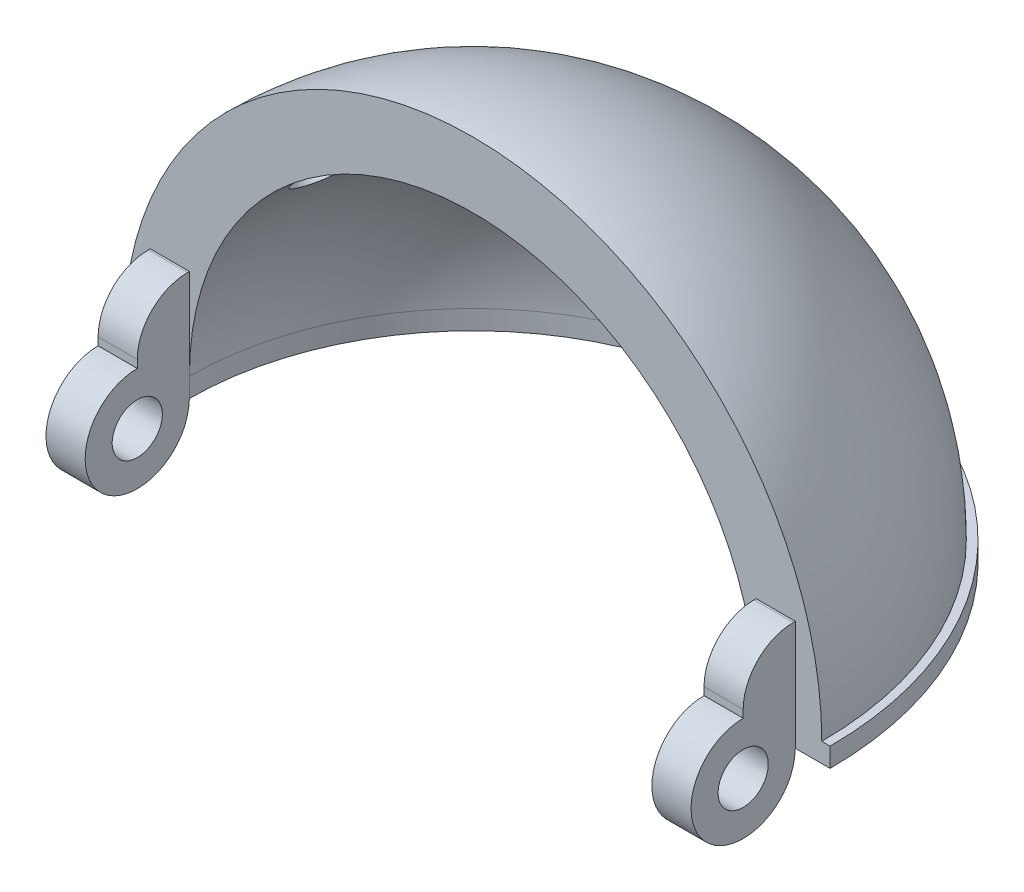
ISO-10303-21;
HEADER;
FILE_DESCRIPTION(('STEP AP214'),'2;1');
FILE_NAME('part.step','',(''),(''),'','','');
FILE_SCHEMA(('AUTOMOTIVE_DESIGN { 1 0 10303 214 1 1 1 1 }'));
ENDSEC;
DATA;
#1=APPLICATION_CONTEXT('core data for automotive mechanical design processes');
#2=APPLICATION_PROTOCOL_DEFINITION('international standard','automotive_design',2000,#1);
#3=PRODUCT_CONTEXT('',#1,'mechanical');
#4=PRODUCT('Part','Part','',(#3));
#5=PRODUCT_RELATED_PRODUCT_CATEGORY('part','',(#4));
#6=PRODUCT_DEFINITION_FORMATION('','',#4);
#7=PRODUCT_DEFINITION_CONTEXT('part definition',#1,'design');
#8=PRODUCT_DEFINITION('design','',#6,#7);
#9=PRODUCT_DEFINITION_SHAPE('','',#8);
#10=(LENGTH_UNIT() NAMED_UNIT(*) SI_UNIT(.MILLI.,.METRE.));
#11=(NAMED_UNIT(*) PLANE_ANGLE_UNIT() SI_UNIT($,.RADIAN.));
#12=(NAMED_UNIT(*) SI_UNIT($,.STERADIAN.) SOLID_ANGLE_UNIT());
#13=UNCERTAINTY_MEASURE_WITH_UNIT(LENGTH_MEASURE(1.E-05),#10,'distance_accuracy_value','');
#14=(GEOMETRIC_REPRESENTATION_CONTEXT(3) GLOBAL_UNCERTAINTY_ASSIGNED_CONTEXT((#13)) GLOBAL_UNIT_ASSIGNED_CONTEXT((#10,
#11,#12)) REPRESENTATION_CONTEXT('',''));
#15=CARTESIAN_POINT('',(0.,0.,0.));
#16=DIRECTION('',(0.,0.,1.));
#17=DIRECTION('',(1.,0.,0.));
#18=AXIS2_PLACEMENT_3D('',#15,#16,#17);
#19=CARTESIAN_POINT('',(-16.1602681796989,3.93657637130622,0.126576371306225));
#20=DIRECTION('',(1.,0.,0.));
#21=DIRECTION('',(0.,0.,-1.));
#22=AXIS2_PLACEMENT_3D('',#19,#20,#21);
#23=CYLINDRICAL_SURFACE('',#22,3.302);
#24=DIRECTION('',(-1.,0.,0.));
#25=VECTOR('',#24,1.);
#26=CARTESIAN_POINT('',(-16.1602681796989,3.93657637130622,3.42857637130622));
#27=LINE('',#26,#25);
#28=CARTESIAN_POINT('',(-13.5836555670863,3.93657637130622,3.42857637130622));
#29=VERTEX_POINT('',#28);
#30=CARTESIAN_POINT('',(-16.1602681796989,3.93657637130622,3.42857637130622));
#31=VERTEX_POINT('',#30);
#32=EDGE_CURVE('E259',#29,#31,#27,.T.);
#33=ORIENTED_EDGE('',*,*,#32,.F.);
#34=CARTESIAN_POINT('',(-13.5836555670863,3.93657637130622,0.126576371306225));
#35=DIRECTION('',(1.,0.,0.));
#36=DIRECTION('',(0.,0.,-1.));
#37=AXIS2_PLACEMENT_3D('',#34,#35,#36);
#38=CIRCLE('',#37,3.302);
#39=CARTESIAN_POINT('',(-13.5836555670863,7.23857637130622,0.126576371306224));
#40=VERTEX_POINT('',#39);
#41=EDGE_CURVE('E43',#40,#29,#38,.T.);
#42=ORIENTED_EDGE('',*,*,#41,.F.);
#43=DIRECTION('',(-1.,0.,0.));
#44=VECTOR('',#43,1.);
#45=CARTESIAN_POINT('',(-16.1602681796989,7.23857637130622,0.126576371306225));
#46=LINE('',#45,#44);
#47=CARTESIAN_POINT('',(-16.1602681796989,7.23857637130622,0.126576371306224));
#48=VERTEX_POINT('',#47);
#49=EDGE_CURVE('E261',#48,#40,#46,.F.);
#50=ORIENTED_EDGE('',*,*,#49,.F.);
#51=CARTESIAN_POINT('',(-16.1602681796989,3.93657637130622,0.126576371306225));
#52=DIRECTION('',(1.,0.,0.));
#53=DIRECTION('',(0.,0.,-1.));
#54=AXIS2_PLACEMENT_3D('',#51,#52,#53);
#55=CIRCLE('',#54,3.302);
#56=EDGE_CURVE('E11',#31,#48,#55,.F.);
#57=ORIENTED_EDGE('',*,*,#56,.F.);
#58=EDGE_LOOP('',(#33,#42,#50,#57));
#59=FACE_BOUND('',#58,.T.);
#60=ADVANCED_FACE('F35',(#59),#23,.T.);
#61=CARTESIAN_POINT('',(0.,3.93657637130622,0.126576371306225));
#62=DIRECTION('',(-1.,0.,0.));
#63=DIRECTION('',(0.,0.,1.));
#64=AXIS2_PLACEMENT_3D('',#61,#62,#63);
#65=CYLINDRICAL_SURFACE('',#64,3.302);
#66=DIRECTION('',(1.,0.,0.));
#67=VECTOR('',#66,1.);
#68=CARTESIAN_POINT('',(0.,7.23857637130622,0.126576371306225));
#69=LINE('',#68,#67);
#70=CARTESIAN_POINT('',(23.6963744629437,7.23857637130622,0.126576371306224));
#71=VERTEX_POINT('',#70);
#72=CARTESIAN_POINT('',(26.2729870755564,7.23857637130622,0.126576371306224));
#73=VERTEX_POINT('',#72);
#74=EDGE_CURVE('E249',#71,#73,#69,.T.);
#75=ORIENTED_EDGE('',*,*,#74,.F.);
#76=CARTESIAN_POINT('',(23.6963744629438,3.93657637130622,0.126576371306225));
#77=DIRECTION('',(-1.,0.,0.));
#78=DIRECTION('',(0.,0.,1.));
#79=AXIS2_PLACEMENT_3D('',#76,#77,#78);
#80=CIRCLE('',#79,3.302);
#81=CARTESIAN_POINT('',(23.6963744629437,3.93657637130622,3.42857637130622));
#82=VERTEX_POINT('',#81);
#83=EDGE_CURVE('E255',#82,#71,#80,.T.);
#84=ORIENTED_EDGE('',*,*,#83,.F.);
#85=DIRECTION('',(1.,0.,0.));
#86=VECTOR('',#85,1.);
#87=CARTESIAN_POINT('',(0.,3.93657637130622,3.42857637130622));
#88=LINE('',#87,#86);
#89=CARTESIAN_POINT('',(26.2729870755564,3.93657637130622,3.42857637130622));
#90=VERTEX_POINT('',#89);
#91=EDGE_CURVE('E252',#90,#82,#88,.F.);
#92=ORIENTED_EDGE('',*,*,#91,.F.);
#93=CARTESIAN_POINT('',(26.2729870755564,3.93657637130622,0.126576371306225));
#94=DIRECTION('',(-1.,0.,0.));
#95=DIRECTION('',(0.,0.,1.));
#96=AXIS2_PLACEMENT_3D('',#93,#94,#95);
#97=CIRCLE('',#96,3.302);
#98=EDGE_CURVE('E257',#73,#90,#97,.F.);
#99=ORIENTED_EDGE('',*,*,#98,.F.);
#100=EDGE_LOOP('',(#75,#84,#92,#99));
#101=FACE_BOUND('',#100,.T.);
#102=ADVANCED_FACE('F305',(#101),#65,.T.);
#103=CARTESIAN_POINT('',(23.6963744629438,1.27,0.));
#104=DIRECTION('',(0.,0.,-1.));
#105=DIRECTION('',(-1.,0.,0.));
#106=AXIS2_PLACEMENT_3D('',#103,#104,#105);
#107=PLANE('',#106);
#108=DIRECTION('',(0.,1.,0.));
#109=VECTOR('',#108,1.);
#110=CARTESIAN_POINT('',(-16.1602681796989,-50.292,0.));
#111=LINE('',#110,#109);
#112=CARTESIAN_POINT('',(-16.1602681796989,0.,0.));
#113=VERTEX_POINT('',#112);
#114=CARTESIAN_POINT('',(-16.1602681796989,7.23857637130622,0.));
#115=VERTEX_POINT('',#114);
#116=EDGE_CURVE('E188',#113,#115,#111,.T.);
#117=ORIENTED_EDGE('',*,*,#116,.T.);
#118=DIRECTION('',(-1.,0.,0.));
#119=VECTOR('',#118,1.);
#120=CARTESIAN_POINT('',(-16.1602681796989,7.23857637130622,0.));
#121=LINE('',#120,#119);
#122=CARTESIAN_POINT('',(-13.5836555670863,7.23857637130622,0.));
#123=VERTEX_POINT('',#122);
#124=EDGE_CURVE('E158',#123,#115,#121,.T.);
#125=ORIENTED_EDGE('',*,*,#124,.F.);
#126=DIRECTION('',(0.,1.,0.));
#127=VECTOR('',#126,1.);
#128=CARTESIAN_POINT('',(-13.5836555670863,-5.08,1.29236898960272E-13));
#129=LINE('',#128,#127);
#130=CARTESIAN_POINT('',(-13.5836555670863,1.27,1.29236898960272E-13));
#131=VERTEX_POINT('',#130);
#132=EDGE_CURVE('E212',#131,#123,#129,.T.);
#133=ORIENTED_EDGE('',*,*,#132,.F.);
#134=CARTESIAN_POINT('',(5.05635944792873,1.26999999999994,0.));
#135=DIRECTION('',(0.,0.,-1.));
#136=DIRECTION('',(0.,1.,0.));
#137=AXIS2_PLACEMENT_3D('',#134,#135,#136);
#138=CIRCLE('',#137,18.640015015015);
#139=CARTESIAN_POINT('',(23.6963744629438,1.27,0.));
#140=VERTEX_POINT('',#139);
#141=EDGE_CURVE('E226',#131,#140,#138,.T.);
#142=ORIENTED_EDGE('',*,*,#141,.T.);
#143=DIRECTION('',(0.,1.,0.));
#144=VECTOR('',#143,1.);
#145=CARTESIAN_POINT('',(23.6963744629438,-5.08,0.));
#146=LINE('',#145,#144);
#147=CARTESIAN_POINT('',(23.6963744629437,7.23857637130622,0.));
#148=VERTEX_POINT('',#147);
#149=EDGE_CURVE('E203',#140,#148,#146,.T.);
#150=ORIENTED_EDGE('',*,*,#149,.T.);
#151=DIRECTION('',(-1.,0.,0.));
#152=VECTOR('',#151,1.);
#153=CARTESIAN_POINT('',(23.6963744629437,7.23857637130622,0.));
#154=LINE('',#153,#152);
#155=CARTESIAN_POINT('',(26.2729870755564,7.23857637130622,0.));
#156=VERTEX_POINT('',#155);
#157=EDGE_CURVE('E283',#156,#148,#154,.T.);
#158=ORIENTED_EDGE('',*,*,#157,.F.);
#159=DIRECTION('',(0.,1.,0.));
#160=VECTOR('',#159,1.);
#161=CARTESIAN_POINT('',(26.2729870755564,-50.292,0.));
#162=LINE('',#161,#160);
#163=CARTESIAN_POINT('',(26.2729870755564,0.,0.));
#164=VERTEX_POINT('',#163);
#165=EDGE_CURVE('E191',#164,#156,#162,.T.);
#166=ORIENTED_EDGE('',*,*,#165,.F.);
#167=DIRECTION('',(1.,0.,0.));
#168=VECTOR('',#167,1.);
#169=CARTESIAN_POINT('',(5.05635944792873,0.,0.));
#170=LINE('',#169,#168);
#171=CARTESIAN_POINT('',(28.5589870755564,0.,0.));
#172=VERTEX_POINT('',#171);
#173=EDGE_CURVE('E195',#164,#172,#170,.T.);
#174=ORIENTED_EDGE('',*,*,#173,.T.);
#175=DIRECTION('',(0.,-1.,0.));
#176=VECTOR('',#175,1.);
#177=CARTESIAN_POINT('',(28.5589870755564,1.27,0.));
#178=LINE('',#177,#176);
#179=CARTESIAN_POINT('',(28.5589870755564,1.27,0.));
#180=VERTEX_POINT('',#179);
#181=EDGE_CURVE('E336',#180,#172,#178,.T.);
#182=ORIENTED_EDGE('',*,*,#181,.F.);
#183=DIRECTION('',(1.,0.,0.));
#184=VECTOR('',#183,1.);
#185=CARTESIAN_POINT('',(5.05635944792873,1.27,0.));
#186=LINE('',#185,#184);
#187=CARTESIAN_POINT('',(28.0143744629438,1.27,0.));
#188=VERTEX_POINT('',#187);
#189=EDGE_CURVE('E205',#188,#180,#186,.T.);
#190=ORIENTED_EDGE('',*,*,#189,.F.);
#191=CARTESIAN_POINT('',(5.05635944792873,1.27,0.));
#192=DIRECTION('',(0.,0.,1.));
#193=DIRECTION('',(0.,1.,0.));
#194=AXIS2_PLACEMENT_3D('',#191,#192,#193);
#195=CIRCLE('',#194,22.958015015015);
#196=CARTESIAN_POINT('',(-17.9016555670863,1.27,0.));
#197=VERTEX_POINT('',#196);
#198=EDGE_CURVE('E234',#188,#197,#195,.T.);
#199=ORIENTED_EDGE('',*,*,#198,.T.);
#200=DIRECTION('',(1.,0.,0.));
#201=VECTOR('',#200,1.);
#202=CARTESIAN_POINT('',(5.05635944792873,1.27,1.29236898960272E-13));
#203=LINE('',#202,#201);
#204=CARTESIAN_POINT('',(-18.4462681796989,1.27,1.29236898960272E-13));
#205=VERTEX_POINT('',#204);
#206=EDGE_CURVE('E220',#205,#197,#203,.T.);
#207=ORIENTED_EDGE('',*,*,#206,.F.);
#208=DIRECTION('',(0.,-1.,0.));
#209=VECTOR('',#208,1.);
#210=CARTESIAN_POINT('',(-18.4462681796989,1.27,0.));
#211=LINE('',#210,#209);
#212=CARTESIAN_POINT('',(-18.4462681796989,0.,1.29236898960272E-13));
#213=VERTEX_POINT('',#212);
#214=EDGE_CURVE('E232',#205,#213,#211,.T.);
#215=ORIENTED_EDGE('',*,*,#214,.T.);
#216=DIRECTION('',(1.,0.,0.));
#217=VECTOR('',#216,1.);
#218=CARTESIAN_POINT('',(5.05635944792873,0.,1.29236898960272E-13));
#219=LINE('',#218,#217);
#220=EDGE_CURVE('E218',#213,#113,#219,.T.);
#221=ORIENTED_EDGE('',*,*,#220,.T.);
#222=EDGE_LOOP('',(#117,#125,#133,#142,#150,#158,#166,#174,#182,#190,#199,#207,#215,#221));
#223=FACE_BOUND('',#222,.T.);
#224=ADVANCED_FACE('F320',(#223),#107,.F.);
#225=CARTESIAN_POINT('',(-13.5836555670863,0.,7.93553007849928));
#226=DIRECTION('',(1.,0.,0.));
#227=DIRECTION('',(0.,0.,-1.));
#228=AXIS2_PLACEMENT_3D('',#225,#226,#227);
#229=PLANE('',#228);
#230=DIRECTION('',(0.,0.,-1.));
#231=VECTOR('',#230,1.);
#232=CARTESIAN_POINT('',(-13.5836555670863,7.23857637130622,0.));
#233=LINE('',#232,#231);
#234=EDGE_CURVE('E267',#40,#123,#233,.T.);
#235=ORIENTED_EDGE('',*,*,#234,.F.);
#236=ORIENTED_EDGE('',*,*,#41,.T.);
#237=DIRECTION('',(0.,-1.,0.));
#238=VECTOR('',#237,1.);
#239=CARTESIAN_POINT('',(-13.5836555670863,7.23857637130622,3.42857637130622));
#240=LINE('',#239,#238);
#241=CARTESIAN_POINT('',(-13.5836555670863,3.42857637130622,3.42857637130622));
#242=VERTEX_POINT('',#241);
#243=EDGE_CURVE('E146',#29,#242,#240,.T.);
#244=ORIENTED_EDGE('',*,*,#243,.T.);
#245=CARTESIAN_POINT('',(-13.5836555670863,0.,3.42857637130622));
#246=DIRECTION('',(1.,0.,0.));
#247=DIRECTION('',(0.,0.,-1.));
#248=AXIS2_PLACEMENT_3D('',#245,#246,#247);
#249=CIRCLE('',#248,3.42857637130622);
#250=CARTESIAN_POINT('',(-13.5836555670863,-1.45003654551441,0.321724274641177));
#251=VERTEX_POINT('',#250);
#252=EDGE_CURVE('E152',#251,#242,#249,.F.);
#253=ORIENTED_EDGE('',*,*,#252,.F.);
#254=CARTESIAN_POINT('',(-13.5836555670863,0.125912777106715,3.99607513575469));
#255=DIRECTION('',(1.,0.,0.));
#256=DIRECTION('',(0.,0.,-1.));
#257=AXIS2_PLACEMENT_3D('',#254,#255,#256);
#258=CIRCLE('',#257,3.99805834350071);
#259=CARTESIAN_POINT('',(-13.5836555670863,0.,0.));
#260=VERTEX_POINT('',#259);
#261=EDGE_CURVE('E186',#260,#251,#258,.F.);
#262=ORIENTED_EDGE('',*,*,#261,.F.);
#263=DIRECTION('',(0.,-1.,0.));
#264=VECTOR('',#263,1.);
#265=CARTESIAN_POINT('',(-13.5836555670863,1.27,1.29236898960272E-13));
#266=LINE('',#265,#264);
#267=EDGE_CURVE('E343',#131,#260,#266,.T.);
#268=ORIENTED_EDGE('',*,*,#267,.F.);
#269=ORIENTED_EDGE('',*,*,#132,.T.);
#270=EDGE_LOOP('',(#235,#236,#244,#253,#262,#268,#269));
#271=FACE_BOUND('',#270,.T.);
#272=CARTESIAN_POINT('',(-13.5836555670863,0.,3.42857637130622));
#273=DIRECTION('',(1.,0.,0.));
#274=DIRECTION('',(0.,0.,-1.));
#275=AXIS2_PLACEMENT_3D('',#272,#273,#274);
#276=CIRCLE('',#275,1.651);
#277=CARTESIAN_POINT('',(-13.5836555670863,0.,1.77757637130622));
#278=VERTEX_POINT('',#277);
#279=EDGE_CURVE('E200',#278,#278,#276,.T.);
#280=ORIENTED_EDGE('',*,*,#279,.F.);
#281=EDGE_LOOP('',(#280));
#282=FACE_BOUND('',#281,.T.);
#283=ADVANCED_FACE('F149',(#271,#282),#229,.T.);
#284=CARTESIAN_POINT('',(23.6963744629438,0.,7.93553007849928));
#285=DIRECTION('',(-1.,0.,0.));
#286=DIRECTION('',(0.,0.,1.));
#287=AXIS2_PLACEMENT_3D('',#284,#285,#286);
#288=PLANE('',#287);
#289=DIRECTION('',(0.,-1.,0.));
#290=VECTOR('',#289,1.);
#291=CARTESIAN_POINT('',(23.6963744629437,7.23857637130622,3.42857637130622));
#292=LINE('',#291,#290);
#293=CARTESIAN_POINT('',(23.6963744629437,3.42857637130622,3.42857637130622));
#294=VERTEX_POINT('',#293);
#295=EDGE_CURVE('E287',#82,#294,#292,.T.);
#296=ORIENTED_EDGE('',*,*,#295,.F.);
#297=ORIENTED_EDGE('',*,*,#83,.T.);
#298=DIRECTION('',(0.,0.,1.));
#299=VECTOR('',#298,1.);
#300=CARTESIAN_POINT('',(23.6963744629437,7.23857637130622,0.));
#301=LINE('',#300,#299);
#302=EDGE_CURVE('E278',#148,#71,#301,.T.);
#303=ORIENTED_EDGE('',*,*,#302,.F.);
#304=ORIENTED_EDGE('',*,*,#149,.F.);
#305=DIRECTION('',(0.,-1.,0.));
#306=VECTOR('',#305,1.);
#307=CARTESIAN_POINT('',(23.6963744629438,1.27,0.));
#308=LINE('',#307,#306);
#309=CARTESIAN_POINT('',(23.6963744629438,0.,0.));
#310=VERTEX_POINT('',#309);
#311=EDGE_CURVE('E340',#140,#310,#308,.T.);
#312=ORIENTED_EDGE('',*,*,#311,.T.);
#313=CARTESIAN_POINT('',(23.6963744629438,0.125912777106715,3.99607513575469));
#314=DIRECTION('',(-1.,0.,0.));
#315=DIRECTION('',(0.,0.,1.));
#316=AXIS2_PLACEMENT_3D('',#313,#314,#315);
#317=CIRCLE('',#316,3.99805834350071);
#318=CARTESIAN_POINT('',(23.6963744629438,-1.45003654551441,0.321724274641177));
#319=VERTEX_POINT('',#318);
#320=EDGE_CURVE('E184',#319,#310,#317,.F.);
#321=ORIENTED_EDGE('',*,*,#320,.F.);
#322=CARTESIAN_POINT('',(23.6963744629438,0.,3.42857637130622));
#323=DIRECTION('',(-1.,0.,0.));
#324=DIRECTION('',(0.,0.,1.));
#325=AXIS2_PLACEMENT_3D('',#322,#323,#324);
#326=CIRCLE('',#325,3.42857637130622);
#327=EDGE_CURVE('E171',#294,#319,#326,.F.);
#328=ORIENTED_EDGE('',*,*,#327,.F.);
#329=EDGE_LOOP('',(#296,#297,#303,#304,#312,#321,#328));
#330=FACE_BOUND('',#329,.T.);
#331=CARTESIAN_POINT('',(23.6963744629438,0.,3.42857637130622));
#332=DIRECTION('',(-1.,0.,0.));
#333=DIRECTION('',(0.,0.,1.));
#334=AXIS2_PLACEMENT_3D('',#331,#332,#333);
#335=CIRCLE('',#334,1.651);
#336=CARTESIAN_POINT('',(23.6963744629438,0.,5.07957637130622));
#337=VERTEX_POINT('',#336);
#338=EDGE_CURVE('E197',#337,#337,#335,.T.);
#339=ORIENTED_EDGE('',*,*,#338,.F.);
#340=EDGE_LOOP('',(#339));
#341=FACE_BOUND('',#340,.T.);
#342=ADVANCED_FACE('F308',(#330,#341),#288,.T.);
#343=CARTESIAN_POINT('',(26.2729870755564,-50.292,0.));
#344=DIRECTION('',(-1.,0.,0.));
#345=DIRECTION('',(0.,0.,1.));
#346=AXIS2_PLACEMENT_3D('',#343,#344,#345);
#347=PLANE('',#346);
#348=CARTESIAN_POINT('',(26.2729870755564,0.,3.42857637130622));
#349=DIRECTION('',(-1.,0.,0.));
#350=DIRECTION('',(0.,0.,1.));
#351=AXIS2_PLACEMENT_3D('',#348,#349,#350);
#352=CIRCLE('',#351,1.651);
#353=CARTESIAN_POINT('',(26.2729870755564,0.,5.07957637130622));
#354=VERTEX_POINT('',#353);
#355=EDGE_CURVE('E194',#354,#354,#352,.F.);
#356=ORIENTED_EDGE('',*,*,#355,.F.);
#357=EDGE_LOOP('',(#356));
#358=FACE_BOUND('',#357,.T.);
#359=DIRECTION('',(0.,0.,-1.));
#360=VECTOR('',#359,1.);
#361=CARTESIAN_POINT('',(26.2729870755564,7.23857637130622,0.));
#362=LINE('',#361,#360);
#363=EDGE_CURVE('E281',#73,#156,#362,.T.);
#364=ORIENTED_EDGE('',*,*,#363,.F.);
#365=ORIENTED_EDGE('',*,*,#98,.T.);
#366=DIRECTION('',(0.,-1.,0.));
#367=VECTOR('',#366,1.);
#368=CARTESIAN_POINT('',(26.2729870755564,7.23857637130622,3.42857637130622));
#369=LINE('',#368,#367);
#370=CARTESIAN_POINT('',(26.2729870755564,3.42857637130622,3.42857637130622));
#371=VERTEX_POINT('',#370);
#372=EDGE_CURVE('E286',#90,#371,#369,.T.);
#373=ORIENTED_EDGE('',*,*,#372,.T.);
#374=CARTESIAN_POINT('',(26.2729870755564,0.,3.42857637130622));
#375=DIRECTION('',(-1.,0.,0.));
#376=DIRECTION('',(0.,0.,-1.));
#377=AXIS2_PLACEMENT_3D('',#374,#375,#376);
#378=CIRCLE('',#377,3.42857637130622);
#379=CARTESIAN_POINT('',(26.2729870755564,-1.45003654551441,0.321724274641178));
#380=VERTEX_POINT('',#379);
#381=EDGE_CURVE('E176',#380,#371,#378,.T.);
#382=ORIENTED_EDGE('',*,*,#381,.F.);
#383=CARTESIAN_POINT('',(26.2729870755564,0.125912777106715,3.99607513575469));
#384=DIRECTION('',(-1.,0.,0.));
#385=DIRECTION('',(0.,0.,1.));
#386=AXIS2_PLACEMENT_3D('',#383,#384,#385);
#387=CIRCLE('',#386,3.99805834350071);
#388=EDGE_CURVE('E167',#164,#380,#387,.T.);
#389=ORIENTED_EDGE('',*,*,#388,.F.);
#390=ORIENTED_EDGE('',*,*,#165,.T.);
#391=EDGE_LOOP('',(#364,#365,#373,#382,#389,#390));
#392=FACE_BOUND('',#391,.T.);
#393=ADVANCED_FACE('F302',(#358,#392),#347,.F.);
#394=CARTESIAN_POINT('',(-16.1602681796989,-50.292,0.));
#395=DIRECTION('',(1.,0.,0.));
#396=DIRECTION('',(0.,0.,-1.));
#397=AXIS2_PLACEMENT_3D('',#394,#395,#396);
#398=PLANE('',#397);
#399=CARTESIAN_POINT('',(-16.1602681796989,0.,3.42857637130622));
#400=DIRECTION('',(1.,0.,0.));
#401=DIRECTION('',(0.,0.,-1.));
#402=AXIS2_PLACEMENT_3D('',#399,#400,#401);
#403=CIRCLE('',#402,1.651);
#404=CARTESIAN_POINT('',(-16.1602681796989,0.,1.77757637130622));
#405=VERTEX_POINT('',#404);
#406=EDGE_CURVE('E190',#405,#405,#403,.F.);
#407=ORIENTED_EDGE('',*,*,#406,.F.);
#408=EDGE_LOOP('',(#407));
#409=FACE_BOUND('',#408,.T.);
#410=DIRECTION('',(0.,-1.,0.));
#411=VECTOR('',#410,1.);
#412=CARTESIAN_POINT('',(-16.1602681796989,7.23857637130622,3.42857637130622));
#413=LINE('',#412,#411);
#414=CARTESIAN_POINT('',(-16.1602681796989,3.42857637130622,3.42857637130622));
#415=VERTEX_POINT('',#414);
#416=EDGE_CURVE('E157',#31,#415,#413,.T.);
#417=ORIENTED_EDGE('',*,*,#416,.F.);
#418=ORIENTED_EDGE('',*,*,#56,.T.);
#419=DIRECTION('',(0.,0.,1.));
#420=VECTOR('',#419,1.);
#421=CARTESIAN_POINT('',(-16.1602681796989,7.23857637130622,0.));
#422=LINE('',#421,#420);
#423=EDGE_CURVE('E268',#115,#48,#422,.T.);
#424=ORIENTED_EDGE('',*,*,#423,.F.);
#425=ORIENTED_EDGE('',*,*,#116,.F.);
#426=CARTESIAN_POINT('',(-16.1602681796989,0.125912777106715,3.99607513575469));
#427=DIRECTION('',(1.,0.,0.));
#428=DIRECTION('',(0.,0.,-1.));
#429=AXIS2_PLACEMENT_3D('',#426,#427,#428);
#430=CIRCLE('',#429,3.99805834350071);
#431=CARTESIAN_POINT('',(-16.1602681796989,-1.45003654551441,0.321724274641177));
#432=VERTEX_POINT('',#431);
#433=EDGE_CURVE('E243',#113,#432,#430,.F.);
#434=ORIENTED_EDGE('',*,*,#433,.T.);
#435=CARTESIAN_POINT('',(-16.1602681796989,0.,3.42857637130622));
#436=DIRECTION('',(1.,0.,0.));
#437=DIRECTION('',(0.,0.,-1.));
#438=AXIS2_PLACEMENT_3D('',#435,#436,#437);
#439=CIRCLE('',#438,3.42857637130622);
#440=EDGE_CURVE('E168',#432,#415,#439,.F.);
#441=ORIENTED_EDGE('',*,*,#440,.T.);
#442=EDGE_LOOP('',(#417,#418,#424,#425,#434,#441));
#443=FACE_BOUND('',#442,.T.);
#444=ADVANCED_FACE('F373',(#409,#443),#398,.F.);
#445=CARTESIAN_POINT('',(5.05635944792873,1.27,1.29237061760828E-13));
#446=DIRECTION('',(0.,-1.,0.));
#447=DIRECTION('',(0.,0.,-1.));
#448=AXIS2_PLACEMENT_3D('',#445,#446,#447);
#449=CYLINDRICAL_SURFACE('',#448,23.5026276276276);
#450=CARTESIAN_POINT('',(5.05635944792873,0.,1.29237061760828E-13));
#451=DIRECTION('',(0.,1.,0.));
#452=DIRECTION('',(0.,0.,-1.));
#453=AXIS2_PLACEMENT_3D('',#450,#451,#452);
#454=CIRCLE('',#453,23.5026276276276);
#455=EDGE_CURVE('E236',#172,#213,#454,.T.);
#456=ORIENTED_EDGE('',*,*,#455,.T.);
#457=ORIENTED_EDGE('',*,*,#214,.F.);
#458=CARTESIAN_POINT('',(5.05635944792873,1.27,1.29237061760828E-13));
#459=DIRECTION('',(0.,1.,0.));
#460=DIRECTION('',(0.,0.,-1.));
#461=AXIS2_PLACEMENT_3D('',#458,#459,#460);
#462=CIRCLE('',#461,23.5026276276276);
#463=EDGE_CURVE('E339',#180,#205,#462,.T.);
#464=ORIENTED_EDGE('',*,*,#463,.F.);
#465=ORIENTED_EDGE('',*,*,#181,.T.);
#466=EDGE_LOOP('',(#456,#457,#464,#465));
#467=FACE_BOUND('',#466,.T.);
#468=ADVANCED_FACE('F337',(#467),#449,.T.);
#469=CARTESIAN_POINT('',(5.05635944792873,1.27,0.));
#470=DIRECTION('',(0.,-1.,0.));
#471=DIRECTION('',(0.,0.,-1.));
#472=AXIS2_PLACEMENT_3D('',#469,#470,#471);
#473=CYLINDRICAL_SURFACE('',#472,18.640015015015);
#474=CARTESIAN_POINT('',(5.05635944792873,0.,0.));
#475=DIRECTION('',(0.,-1.,0.));
#476=DIRECTION('',(0.,0.,-1.));
#477=AXIS2_PLACEMENT_3D('',#474,#475,#476);
#478=CIRCLE('',#477,18.640015015015);
#479=EDGE_CURVE('E333',#260,#310,#478,.T.);
#480=ORIENTED_EDGE('',*,*,#479,.T.);
#481=ORIENTED_EDGE('',*,*,#311,.F.);
#482=CARTESIAN_POINT('',(5.05635944792873,1.27,0.));
#483=DIRECTION('',(0.,-1.,0.));
#484=DIRECTION('',(0.,0.,-1.));
#485=AXIS2_PLACEMENT_3D('',#482,#483,#484);
#486=CIRCLE('',#485,18.640015015015);
#487=EDGE_CURVE('E341',#131,#140,#486,.T.);
#488=ORIENTED_EDGE('',*,*,#487,.F.);
#489=ORIENTED_EDGE('',*,*,#267,.T.);
#490=EDGE_LOOP('',(#480,#481,#488,#489));
#491=FACE_BOUND('',#490,.T.);
#492=ADVANCED_FACE('F357',(#491),#473,.F.);
#493=CARTESIAN_POINT('',(5.05635944792873,1.27,1.29237061760828E-13));
#494=DIRECTION('',(0.,-1.,0.));
#495=DIRECTION('',(0.,0.,-1.));
#496=AXIS2_PLACEMENT_3D('',#493,#494,#495);
#497=PLANE('',#496);
#498=CARTESIAN_POINT('',(5.05635944792873,1.27,0.));
#499=DIRECTION('',(0.,1.,0.));
#500=DIRECTION('',(0.,0.,-1.));
#501=AXIS2_PLACEMENT_3D('',#498,#499,#500);
#502=CIRCLE('',#501,22.958015015015);
#503=EDGE_CURVE('E223',#188,#197,#502,.T.);
#504=ORIENTED_EDGE('',*,*,#503,.F.);
#505=ORIENTED_EDGE('',*,*,#189,.T.);
#506=ORIENTED_EDGE('',*,*,#463,.T.);
#507=ORIENTED_EDGE('',*,*,#206,.T.);
#508=EDGE_LOOP('',(#504,#505,#506,#507));
#509=FACE_BOUND('',#508,.T.);
#510=ADVANCED_FACE('F355',(#509),#497,.F.);
#511=CARTESIAN_POINT('',(5.05635944792873,0.,1.29237061760828E-13));
#512=DIRECTION('',(0.,-1.,0.));
#513=DIRECTION('',(0.,0.,-1.));
#514=AXIS2_PLACEMENT_3D('',#511,#512,#513);
#515=PLANE('',#514);
#516=DIRECTION('',(1.,0.,0.));
#517=VECTOR('',#516,1.);
#518=CARTESIAN_POINT('',(5.05635944792873,0.,0.));
#519=LINE('',#518,#517);
#520=EDGE_CURVE('E208',#310,#164,#519,.T.);
#521=ORIENTED_EDGE('',*,*,#520,.F.);
#522=ORIENTED_EDGE('',*,*,#479,.F.);
#523=EDGE_CURVE('E215',#113,#260,#219,.T.);
#524=ORIENTED_EDGE('',*,*,#523,.F.);
#525=ORIENTED_EDGE('',*,*,#220,.F.);
#526=ORIENTED_EDGE('',*,*,#455,.F.);
#527=ORIENTED_EDGE('',*,*,#173,.F.);
#528=EDGE_LOOP('',(#521,#522,#524,#525,#526,#527));
#529=FACE_BOUND('',#528,.T.);
#530=ADVANCED_FACE('F323',(#529),#515,.T.);
#531=CARTESIAN_POINT('',(5.05635944792873,1.26999999999994,0.));
#532=DIRECTION('',(-1.,0.,0.));
#533=DIRECTION('',(0.,-1.,0.));
#534=AXIS2_PLACEMENT_3D('',#531,#532,#533);
#535=SPHERICAL_SURFACE('',#534,18.640015015015);
#536=CARTESIAN_POINT('',(-8.35714936829248,13.6258413341722,-3.4835793261962));
#537=DIRECTION('',(0.722447700092947,-0.66548203582579,0.187624573613303));
#538=DIRECTION('',(0.677514134429347,0.735509753605248,0.));
#539=AXIS2_PLACEMENT_3D('',#536,#537,#538);
#540=CIRCLE('',#539,1.65099999999999);
#541=CARTESIAN_POINT('',(-7.23857353234963,14.8401679373745,-3.4835793261962));
#542=VERTEX_POINT('',#541);
#543=EDGE_CURVE('E273',#542,#542,#540,.F.);
#544=ORIENTED_EDGE('',*,*,#543,.T.);
#545=EDGE_LOOP('',(#544));
#546=FACE_BOUND('',#545,.T.);
#547=ORIENTED_EDGE('',*,*,#487,.T.);
#548=ORIENTED_EDGE('',*,*,#141,.F.);
#549=EDGE_LOOP('',(#547,#548));
#550=FACE_BOUND('',#549,.T.);
#551=ADVANCED_FACE('F398',(#546,#550),#535,.F.);
#552=CARTESIAN_POINT('',(5.05635944792873,1.27,0.));
#553=DIRECTION('',(-1.,0.,0.));
#554=DIRECTION('',(0.,1.,0.));
#555=AXIS2_PLACEMENT_3D('',#552,#553,#554);
#556=SPHERICAL_SURFACE('',#555,22.958015015015);
#557=CARTESIAN_POINT('',(-11.4866620616511,16.5085890791661,-4.29633502412878));
#558=DIRECTION('',(0.722447700092947,-0.66548203582579,0.187624573613303));
#559=DIRECTION('',(0.677514134429347,0.735509753605248,0.));
#560=AXIS2_PLACEMENT_3D('',#557,#558,#559);
#561=CIRCLE('',#560,1.65099999999999);
#562=CARTESIAN_POINT('',(-10.3680862257082,17.7229156823683,-4.29633502412878));
#563=VERTEX_POINT('',#562);
#564=EDGE_CURVE('E38',#563,#563,#561,.T.);
#565=ORIENTED_EDGE('',*,*,#564,.T.);
#566=EDGE_LOOP('',(#565));
#567=FACE_BOUND('',#566,.T.);
#568=ORIENTED_EDGE('',*,*,#503,.T.);
#569=ORIENTED_EDGE('',*,*,#198,.F.);
#570=EDGE_LOOP('',(#568,#569));
#571=FACE_BOUND('',#570,.T.);
#572=ADVANCED_FACE('F401',(#567,#571),#556,.T.);
#573=CARTESIAN_POINT('',(36.9257318203011,0.,3.42857637130622));
#574=DIRECTION('',(-1.,0.,0.));
#575=DIRECTION('',(0.,0.,1.));
#576=AXIS2_PLACEMENT_3D('',#573,#574,#575);
#577=CYLINDRICAL_SURFACE('',#576,1.651);
#578=ORIENTED_EDGE('',*,*,#355,.T.);
#579=EDGE_LOOP('',(#578));
#580=FACE_BOUND('',#579,.T.);
#581=ORIENTED_EDGE('',*,*,#338,.T.);
#582=EDGE_LOOP('',(#581));
#583=FACE_BOUND('',#582,.T.);
#584=ADVANCED_FACE('F383',(#580,#583),#577,.F.);
#585=ORIENTED_EDGE('',*,*,#406,.T.);
#586=EDGE_LOOP('',(#585));
#587=FACE_BOUND('',#586,.T.);
#588=ORIENTED_EDGE('',*,*,#279,.T.);
#589=EDGE_LOOP('',(#588));
#590=FACE_BOUND('',#589,.T.);
#591=ADVANCED_FACE('F377',(#587,#590),#577,.F.);
#592=CARTESIAN_POINT('',(-29.0990129244436,0.125912777106715,3.99607513575469));
#593=DIRECTION('',(1.,0.,0.));
#594=DIRECTION('',(0.,0.,-1.));
#595=AXIS2_PLACEMENT_3D('',#592,#593,#594);
#596=CYLINDRICAL_SURFACE('',#595,3.99805834350071);
#597=ORIENTED_EDGE('',*,*,#261,.T.);
#598=DIRECTION('',(1.,0.,0.));
#599=VECTOR('',#598,1.);
#600=CARTESIAN_POINT('',(-1.66701292444364,-1.45003654551441,0.321724274641177));
#601=LINE('',#600,#599);
#602=EDGE_CURVE('E166',#251,#432,#601,.F.);
#603=ORIENTED_EDGE('',*,*,#602,.T.);
#604=ORIENTED_EDGE('',*,*,#433,.F.);
#605=ORIENTED_EDGE('',*,*,#523,.T.);
#606=EDGE_LOOP('',(#597,#603,#604,#605));
#607=FACE_BOUND('',#606,.T.);
#608=ADVANCED_FACE('F375',(#607),#596,.T.);
#609=ORIENTED_EDGE('',*,*,#388,.T.);
#610=DIRECTION('',(1.,0.,0.));
#611=VECTOR('',#610,1.);
#612=CARTESIAN_POINT('',(-1.66701292444364,-1.45003654551441,0.321724274641177));
#613=LINE('',#612,#611);
#614=EDGE_CURVE('E246',#380,#319,#613,.F.);
#615=ORIENTED_EDGE('',*,*,#614,.T.);
#616=ORIENTED_EDGE('',*,*,#320,.T.);
#617=ORIENTED_EDGE('',*,*,#520,.T.);
#618=EDGE_LOOP('',(#609,#615,#616,#617));
#619=FACE_BOUND('',#618,.T.);
#620=ADVANCED_FACE('F314',(#619),#596,.T.);
#621=CARTESIAN_POINT('',(-29.6070129244436,0.,3.42857637130622));
#622=DIRECTION('',(1.,0.,0.));
#623=DIRECTION('',(0.,0.,-1.));
#624=AXIS2_PLACEMENT_3D('',#621,#622,#623);
#625=CYLINDRICAL_SURFACE('',#624,3.42857637130622);
#626=ORIENTED_EDGE('',*,*,#327,.T.);
#627=ORIENTED_EDGE('',*,*,#614,.F.);
#628=ORIENTED_EDGE('',*,*,#381,.T.);
#629=DIRECTION('',(1.,0.,0.));
#630=VECTOR('',#629,1.);
#631=CARTESIAN_POINT('',(-29.6070129244436,3.42857637130622,3.42857637130622));
#632=LINE('',#631,#630);
#633=EDGE_CURVE('E172',#294,#371,#632,.T.);
#634=ORIENTED_EDGE('',*,*,#633,.F.);
#635=EDGE_LOOP('',(#626,#627,#628,#634));
#636=FACE_BOUND('',#635,.T.);
#637=ADVANCED_FACE('F294',(#636),#625,.T.);
#638=ORIENTED_EDGE('',*,*,#252,.T.);
#639=EDGE_CURVE('E163',#415,#242,#632,.T.);
#640=ORIENTED_EDGE('',*,*,#639,.F.);
#641=ORIENTED_EDGE('',*,*,#440,.F.);
#642=ORIENTED_EDGE('',*,*,#602,.F.);
#643=EDGE_LOOP('',(#638,#640,#641,#642));
#644=FACE_BOUND('',#643,.T.);
#645=ADVANCED_FACE('F162',(#644),#625,.T.);
#646=CARTESIAN_POINT('',(23.6963744629437,7.23857637130622,3.42857637130622));
#647=DIRECTION('',(0.,0.,-1.));
#648=DIRECTION('',(-1.,0.,0.));
#649=AXIS2_PLACEMENT_3D('',#646,#647,#648);
#650=PLANE('',#649);
#651=ORIENTED_EDGE('',*,*,#372,.F.);
#652=ORIENTED_EDGE('',*,*,#91,.T.);
#653=ORIENTED_EDGE('',*,*,#295,.T.);
#654=ORIENTED_EDGE('',*,*,#633,.T.);
#655=EDGE_LOOP('',(#651,#652,#653,#654));
#656=FACE_BOUND('',#655,.T.);
#657=ADVANCED_FACE('F299',(#656),#650,.F.);
#658=CARTESIAN_POINT('',(0.,7.23857637130622,0.));
#659=DIRECTION('',(0.,1.,0.));
#660=DIRECTION('',(0.,0.,1.));
#661=AXIS2_PLACEMENT_3D('',#658,#659,#660);
#662=PLANE('',#661);
#663=ORIENTED_EDGE('',*,*,#302,.T.);
#664=ORIENTED_EDGE('',*,*,#74,.T.);
#665=ORIENTED_EDGE('',*,*,#363,.T.);
#666=ORIENTED_EDGE('',*,*,#157,.T.);
#667=EDGE_LOOP('',(#663,#664,#665,#666));
#668=FACE_BOUND('',#667,.T.);
#669=ADVANCED_FACE('F360',(#668),#662,.T.);
#670=CARTESIAN_POINT('',(-16.1602681796989,7.23857637130622,3.42857637130622));
#671=DIRECTION('',(0.,0.,-1.));
#672=DIRECTION('',(-1.,0.,0.));
#673=AXIS2_PLACEMENT_3D('',#670,#671,#672);
#674=PLANE('',#673);
#675=ORIENTED_EDGE('',*,*,#243,.F.);
#676=ORIENTED_EDGE('',*,*,#32,.T.);
#677=ORIENTED_EDGE('',*,*,#416,.T.);
#678=ORIENTED_EDGE('',*,*,#639,.T.);
#679=EDGE_LOOP('',(#675,#676,#677,#678));
#680=FACE_BOUND('',#679,.T.);
#681=ADVANCED_FACE('F170',(#680),#674,.F.);
#682=CARTESIAN_POINT('',(0.,7.23857637130622,0.));
#683=DIRECTION('',(0.,1.,0.));
#684=DIRECTION('',(0.,0.,1.));
#685=AXIS2_PLACEMENT_3D('',#682,#683,#684);
#686=PLANE('',#685);
#687=ORIENTED_EDGE('',*,*,#423,.T.);
#688=ORIENTED_EDGE('',*,*,#49,.T.);
#689=ORIENTED_EDGE('',*,*,#234,.T.);
#690=ORIENTED_EDGE('',*,*,#124,.T.);
#691=EDGE_LOOP('',(#687,#688,#689,#690));
#692=FACE_BOUND('',#691,.T.);
#693=ADVANCED_FACE('F265',(#692),#686,.T.);
#694=CARTESIAN_POINT('',(-11.5296056983682,16.5481465707112,-4.3074877782));
#695=DIRECTION('',(-0.722447700092947,0.66548203582579,-0.187624573613303));
#696=DIRECTION('',(-0.677514134429347,-0.735509753605248,0.));
#697=AXIS2_PLACEMENT_3D('',#694,#695,#696);
#698=CYLINDRICAL_SURFACE('',#697,1.65099999999999);
#699=ORIENTED_EDGE('',*,*,#564,.F.);
#700=EDGE_LOOP('',(#699));
#701=FACE_BOUND('',#700,.T.);
#702=ORIENTED_EDGE('',*,*,#543,.F.);
#703=EDGE_LOOP('',(#702));
#704=FACE_BOUND('',#703,.T.);
#705=ADVANCED_FACE('F560',(#701,#704),#698,.F.);
#706=CLOSED_SHELL('',(#60,#102,#224,#283,#342,#393,#444,#468,#492,#510,#530,#551,#572,#584,#591,
#608,#620,#637,#645,#657,#669,#681,#693,#705));
#707=MANIFOLD_SOLID_BREP('B2',#706);
#708=ADVANCED_BREP_SHAPE_REPRESENTATION('',(#18,#707),#14);
#709=SHAPE_DEFINITION_REPRESENTATION(#9,#708);
ENDSEC;
END-ISO-10303-21;
